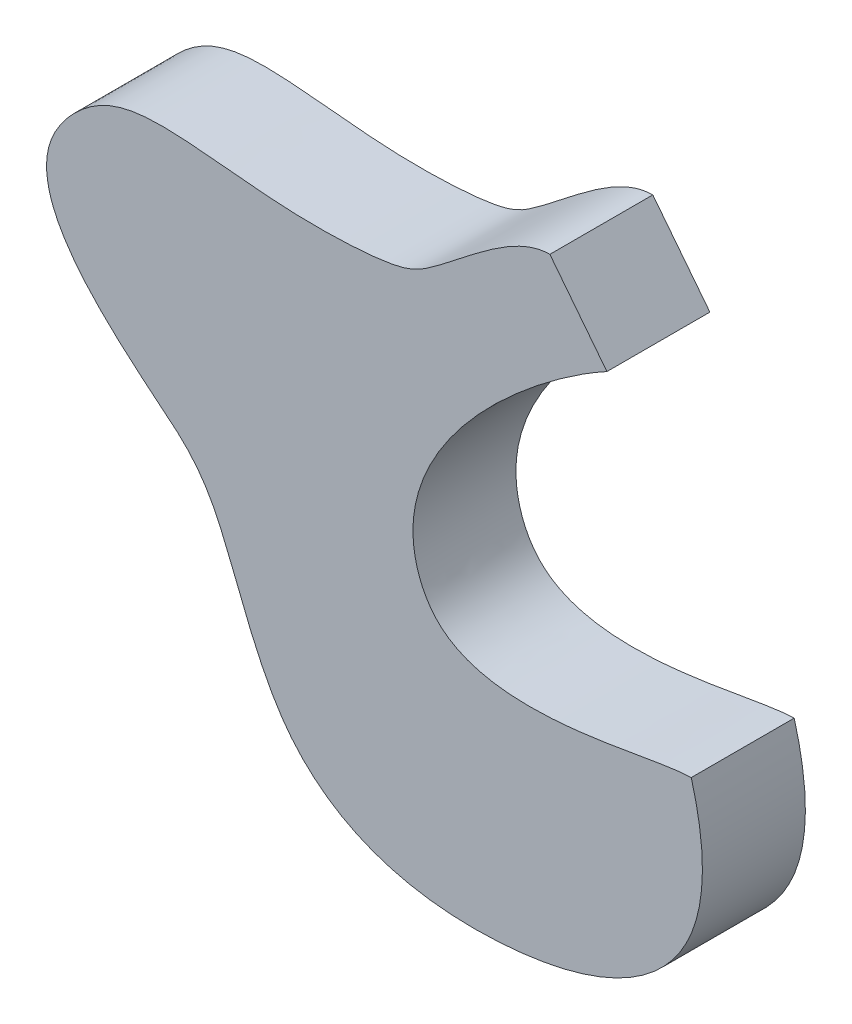
ISO-10303-21;
HEADER;
FILE_DESCRIPTION(('STEP AP214'),'2;1');
FILE_NAME('part.step','',(''),(''),'','','');
FILE_SCHEMA(('AUTOMOTIVE_DESIGN { 1 0 10303 214 1 1 1 1 }'));
ENDSEC;
DATA;
#1=APPLICATION_CONTEXT('core data for automotive mechanical design processes');
#2=APPLICATION_PROTOCOL_DEFINITION('international standard','automotive_design',2000,#1);
#3=PRODUCT_CONTEXT('',#1,'mechanical');
#4=PRODUCT('Part','Part','',(#3));
#5=PRODUCT_RELATED_PRODUCT_CATEGORY('part','',(#4));
#6=PRODUCT_DEFINITION_FORMATION('','',#4);
#7=PRODUCT_DEFINITION_CONTEXT('part definition',#1,'design');
#8=PRODUCT_DEFINITION('design','',#6,#7);
#9=PRODUCT_DEFINITION_SHAPE('','',#8);
#10=(LENGTH_UNIT() NAMED_UNIT(*) SI_UNIT(.MILLI.,.METRE.));
#11=(NAMED_UNIT(*) PLANE_ANGLE_UNIT() SI_UNIT($,.RADIAN.));
#12=(NAMED_UNIT(*) SI_UNIT($,.STERADIAN.) SOLID_ANGLE_UNIT());
#13=UNCERTAINTY_MEASURE_WITH_UNIT(LENGTH_MEASURE(1.E-05),#10,'distance_accuracy_value','');
#14=(GEOMETRIC_REPRESENTATION_CONTEXT(3) GLOBAL_UNCERTAINTY_ASSIGNED_CONTEXT((#13)) GLOBAL_UNIT_ASSIGNED_CONTEXT((#10,
#11,#12)) REPRESENTATION_CONTEXT('',''));
#15=CARTESIAN_POINT('',(0.,0.,0.));
#16=DIRECTION('',(0.,0.,1.));
#17=DIRECTION('',(1.,0.,0.));
#18=AXIS2_PLACEMENT_3D('',#15,#16,#17);
#19=CARTESIAN_POINT('',(0.,0.,0.));
#20=DIRECTION('',(0.,0.,1.));
#21=DIRECTION('',(1.,0.,0.));
#22=AXIS2_PLACEMENT_3D('',#19,#20,#21);
#23=PLANE('',#22);
#24=CARTESIAN_POINT('',(10.1239503754966,7.47167338775571,0.));
#25=CARTESIAN_POINT('',(8.88456417748358,7.47167338775565,0.));
#26=CARTESIAN_POINT('',(3.25817092606444,5.69988092610236,0.));
#27=CARTESIAN_POINT('',(0.926400169189449,11.7116788020107,0.));
#28=CARTESIAN_POINT('',(5.81871410871451,15.4950682485769,0.));
#29=CARTESIAN_POINT('',(7.66692159697958,16.4874061626762,0.));
#30=B_SPLINE_CURVE_WITH_KNOTS('',3,(#24,#25,#26,#27,#28,#29),.UNSPECIFIED.,.F.,.F.,(4,1,1,4),
(0.,0.40081153336426,0.508983871765493,1.),.UNSPECIFIED.);
#31=CARTESIAN_POINT('',(10.1239503754966,7.47167338775571,0.));
#32=VERTEX_POINT('',#31);
#33=CARTESIAN_POINT('',(7.66692159697958,16.4874061626762,0.));
#34=VERTEX_POINT('',#33);
#35=EDGE_CURVE('E11',#32,#34,#30,.T.);
#36=ORIENTED_EDGE('',*,*,#35,.F.);
#37=CARTESIAN_POINT('',(6.00410268052964,18.6149473273583,0.));
#38=CARTESIAN_POINT('',(4.89826864054042,18.6156669314184,0.));
#39=CARTESIAN_POINT('',(3.11436350916105,16.8317617256849,0.));
#40=CARTESIAN_POINT('',(1.65480481779303,16.0208959436191,0.));
#41=CARTESIAN_POINT('',(-0.858879795014004,15.8587220884871,0.));
#42=CARTESIAN_POINT('',(-4.46723202154498,16.1425314590486,0.));
#43=CARTESIAN_POINT('',(-6.73767024878818,16.5073554673805,0.));
#44=CARTESIAN_POINT('',(-9.93894354085253,13.0919401595709,0.));
#45=CARTESIAN_POINT('',(-6.56044138866542,10.050671278722,0.));
#46=CARTESIAN_POINT('',(-3.60685683672063,7.74158461381329,0.));
#47=CARTESIAN_POINT('',(-1.8783839516731,1.24522214690666,0.));
#48=CARTESIAN_POINT('',(5.66839216558139,-0.386907423717556,0.));
#49=CARTESIAN_POINT('',(11.5441588172949,2.38641090260705,0.));
#50=CARTESIAN_POINT('',(10.1239503754966,7.47167338775571,0.));
#51=B_SPLINE_CURVE_WITH_KNOTS('',3,(#37,#38,#39,#40,#41,#42,#43,#44,#45,#46,#47,#48,#49,#50),
.UNSPECIFIED.,.F.,.F.,(4,1,1,1,1,1,1,1,1,1,1,4),(0.,0.0802222470007275,0.0994165534665624,
0.127759844305823,0.16480267792436,0.28578934655498,0.348586519303262,0.561441344111233,
0.624931440044484,0.706633457073088,0.826195838523127,1.),.UNSPECIFIED.);
#52=CARTESIAN_POINT('',(6.00410268052964,18.6149473273583,0.));
#53=VERTEX_POINT('',#52);
#54=EDGE_CURVE('E85',#53,#32,#51,.T.);
#55=ORIENTED_EDGE('',*,*,#54,.F.);
#56=DIRECTION('',(-0.615799808347989,0.787902656448486,0.));
#57=VECTOR('',#56,1.);
#58=CARTESIAN_POINT('',(12.7590824500243,9.97209549062469,0.));
#59=LINE('',#58,#57);
#60=EDGE_CURVE('E74',#34,#53,#59,.T.);
#61=ORIENTED_EDGE('',*,*,#60,.F.);
#62=EDGE_LOOP('',(#36,#55,#61));
#63=FACE_BOUND('',#62,.T.);
#64=ADVANCED_FACE('F39',(#63),#23,.F.);
#65=CARTESIAN_POINT('',(6.00410268052964,18.6149473273583,10.));
#66=CARTESIAN_POINT('',(4.89826864054042,18.6156669314184,10.));
#67=CARTESIAN_POINT('',(3.11436350916105,16.8317617256849,10.));
#68=CARTESIAN_POINT('',(1.65480481779303,16.0208959436191,10.));
#69=CARTESIAN_POINT('',(-0.858879795014004,15.8587220884871,10.));
#70=CARTESIAN_POINT('',(-4.46723202154498,16.1425314590486,10.));
#71=CARTESIAN_POINT('',(-6.73767024878818,16.5073554673805,10.));
#72=CARTESIAN_POINT('',(-9.93894354085253,13.0919401595709,10.));
#73=CARTESIAN_POINT('',(-6.56044138866542,10.050671278722,10.));
#74=CARTESIAN_POINT('',(-3.60685683672063,7.74158461381329,10.));
#75=CARTESIAN_POINT('',(-1.8783839516731,1.24522214690666,10.));
#76=CARTESIAN_POINT('',(5.66839216558139,-0.386907423717556,10.));
#77=CARTESIAN_POINT('',(11.5441588172949,2.38641090260705,10.));
#78=CARTESIAN_POINT('',(10.1239503754966,7.47167338775571,10.));
#79=B_SPLINE_CURVE_WITH_KNOTS('',3,(#65,#66,#67,#68,#69,#70,#71,#72,#73,#74,#75,#76,#77,#78),
.UNSPECIFIED.,.F.,.F.,(4,1,1,1,1,1,1,1,1,1,1,4),(0.,0.0802222470007275,0.0994165534665624,
0.127759844305823,0.16480267792436,0.28578934655498,0.348586519303262,0.561441344111233,
0.624931440044484,0.706633457073088,0.826195838523127,1.),.UNSPECIFIED.);
#80=DIRECTION('',(0.,0.,-1.));
#81=VECTOR('',#80,1.);
#82=SURFACE_OF_LINEAR_EXTRUSION('',#79,#81);
#83=CARTESIAN_POINT('',(6.00410268052964,18.6149473273583,3.));
#84=CARTESIAN_POINT('',(4.89826864054042,18.6156669314184,3.));
#85=CARTESIAN_POINT('',(3.11436350916105,16.8317617256849,3.));
#86=CARTESIAN_POINT('',(1.65480481779303,16.0208959436191,3.));
#87=CARTESIAN_POINT('',(-0.858879795014004,15.8587220884871,3.));
#88=CARTESIAN_POINT('',(-4.46723202154498,16.1425314590486,3.));
#89=CARTESIAN_POINT('',(-6.73767024878818,16.5073554673805,3.));
#90=CARTESIAN_POINT('',(-9.93894354085253,13.0919401595709,3.));
#91=CARTESIAN_POINT('',(-6.56044138866542,10.050671278722,3.));
#92=CARTESIAN_POINT('',(-3.60685683672063,7.74158461381329,3.));
#93=CARTESIAN_POINT('',(-1.8783839516731,1.24522214690666,3.));
#94=CARTESIAN_POINT('',(5.66839216558139,-0.386907423717556,3.));
#95=CARTESIAN_POINT('',(11.5441588172949,2.38641090260705,3.));
#96=CARTESIAN_POINT('',(10.1239503754966,7.47167338775571,3.));
#97=B_SPLINE_CURVE_WITH_KNOTS('',3,(#83,#84,#85,#86,#87,#88,#89,#90,#91,#92,#93,#94,#95,#96),
.UNSPECIFIED.,.F.,.F.,(4,1,1,1,1,1,1,1,1,1,1,4),(0.,0.0802222470007275,0.0994165534665624,
0.127759844305823,0.16480267792436,0.28578934655498,0.348586519303262,0.561441344111233,
0.624931440044484,0.706633457073088,0.826195838523127,1.),.UNSPECIFIED.);
#98=CARTESIAN_POINT('',(10.1239503754966,7.47167338775571,3.));
#99=VERTEX_POINT('',#98);
#100=CARTESIAN_POINT('',(6.00410268052964,18.6149473273583,3.));
#101=VERTEX_POINT('',#100);
#102=EDGE_CURVE('E122',#99,#101,#97,.F.);
#103=ORIENTED_EDGE('',*,*,#102,.T.);
#104=DIRECTION('',(0.,0.,-1.));
#105=VECTOR('',#104,1.);
#106=CARTESIAN_POINT('',(6.00410268052964,18.6149473273583,10.));
#107=LINE('',#106,#105);
#108=EDGE_CURVE('E95',#101,#53,#107,.T.);
#109=ORIENTED_EDGE('',*,*,#108,.T.);
#110=ORIENTED_EDGE('',*,*,#54,.T.);
#111=DIRECTION('',(0.,0.,-1.));
#112=VECTOR('',#111,1.);
#113=CARTESIAN_POINT('',(10.1239503754966,7.47167338775571,10.));
#114=LINE('',#113,#112);
#115=EDGE_CURVE('E51',#99,#32,#114,.T.);
#116=ORIENTED_EDGE('',*,*,#115,.F.);
#117=EDGE_LOOP('',(#103,#109,#110,#116));
#118=FACE_BOUND('',#117,.T.);
#119=ADVANCED_FACE('F110',(#118),#82,.F.);
#120=CARTESIAN_POINT('',(12.7590824500243,9.97209549062469,10.));
#121=DIRECTION('',(-0.787902656448486,-0.615799808347989,0.));
#122=DIRECTION('',(0.615799808347989,-0.787902656448486,0.));
#123=AXIS2_PLACEMENT_3D('',#120,#121,#122);
#124=PLANE('',#123);
#125=DIRECTION('',(0.615799808347989,-0.787902656448486,0.));
#126=VECTOR('',#125,1.);
#127=CARTESIAN_POINT('',(12.7590824500243,9.97209549062469,3.));
#128=LINE('',#127,#126);
#129=CARTESIAN_POINT('',(7.66692159697958,16.4874061626762,3.));
#130=VERTEX_POINT('',#129);
#131=EDGE_CURVE('E77',#101,#130,#128,.T.);
#132=ORIENTED_EDGE('',*,*,#131,.T.);
#133=DIRECTION('',(0.,0.,-1.));
#134=VECTOR('',#133,1.);
#135=CARTESIAN_POINT('',(7.66692159697958,16.4874061626762,10.));
#136=LINE('',#135,#134);
#137=EDGE_CURVE('E59',#130,#34,#136,.T.);
#138=ORIENTED_EDGE('',*,*,#137,.T.);
#139=ORIENTED_EDGE('',*,*,#60,.T.);
#140=ORIENTED_EDGE('',*,*,#108,.F.);
#141=EDGE_LOOP('',(#132,#138,#139,#140));
#142=FACE_BOUND('',#141,.T.);
#143=ADVANCED_FACE('F71',(#142),#124,.F.);
#144=CARTESIAN_POINT('',(10.1239503754966,7.47167338775571,10.));
#145=CARTESIAN_POINT('',(8.88456417748358,7.47167338775565,10.));
#146=CARTESIAN_POINT('',(3.25817092606444,5.69988092610236,10.));
#147=CARTESIAN_POINT('',(0.926400169189449,11.7116788020107,10.));
#148=CARTESIAN_POINT('',(5.81871410871451,15.4950682485769,10.));
#149=CARTESIAN_POINT('',(7.66692159697958,16.4874061626762,10.));
#150=B_SPLINE_CURVE_WITH_KNOTS('',3,(#144,#145,#146,#147,#148,#149),.UNSPECIFIED.,.F.,.F.,(4,1,
1,4),(0.,0.40081153336426,0.508983871765493,1.),.UNSPECIFIED.);
#151=DIRECTION('',(0.,0.,-1.));
#152=VECTOR('',#151,1.);
#153=SURFACE_OF_LINEAR_EXTRUSION('',#150,#152);
#154=CARTESIAN_POINT('',(10.1239503754966,7.47167338775571,3.));
#155=CARTESIAN_POINT('',(8.88456417748358,7.47167338775565,3.));
#156=CARTESIAN_POINT('',(3.25817092606444,5.69988092610236,3.));
#157=CARTESIAN_POINT('',(0.926400169189449,11.7116788020107,3.));
#158=CARTESIAN_POINT('',(5.81871410871451,15.4950682485769,3.));
#159=CARTESIAN_POINT('',(7.66692159697958,16.4874061626762,3.));
#160=B_SPLINE_CURVE_WITH_KNOTS('',3,(#154,#155,#156,#157,#158,#159),.UNSPECIFIED.,.F.,.F.,(4,1,
1,4),(0.,0.40081153336426,0.508983871765493,1.),.UNSPECIFIED.);
#161=EDGE_CURVE('E86',#130,#99,#160,.F.);
#162=ORIENTED_EDGE('',*,*,#161,.T.);
#163=ORIENTED_EDGE('',*,*,#115,.T.);
#164=ORIENTED_EDGE('',*,*,#35,.T.);
#165=ORIENTED_EDGE('',*,*,#137,.F.);
#166=EDGE_LOOP('',(#162,#163,#164,#165));
#167=FACE_BOUND('',#166,.T.);
#168=ADVANCED_FACE('F82',(#167),#153,.F.);
#169=CARTESIAN_POINT('',(0.,0.,3.));
#170=DIRECTION('',(0.,0.,1.));
#171=DIRECTION('',(1.,0.,0.));
#172=AXIS2_PLACEMENT_3D('',#169,#170,#171);
#173=PLANE('',#172);
#174=ORIENTED_EDGE('',*,*,#102,.F.);
#175=ORIENTED_EDGE('',*,*,#161,.F.);
#176=ORIENTED_EDGE('',*,*,#131,.F.);
#177=EDGE_LOOP('',(#174,#175,#176));
#178=FACE_BOUND('',#177,.T.);
#179=ADVANCED_FACE('F41',(#178),#173,.T.);
#180=CLOSED_SHELL('',(#64,#119,#143,#168,#179));
#181=MANIFOLD_SOLID_BREP('B2',#180);
#182=ADVANCED_BREP_SHAPE_REPRESENTATION('',(#18,#181),#14);
#183=SHAPE_DEFINITION_REPRESENTATION(#9,#182);
ENDSEC;
END-ISO-10303-21;
